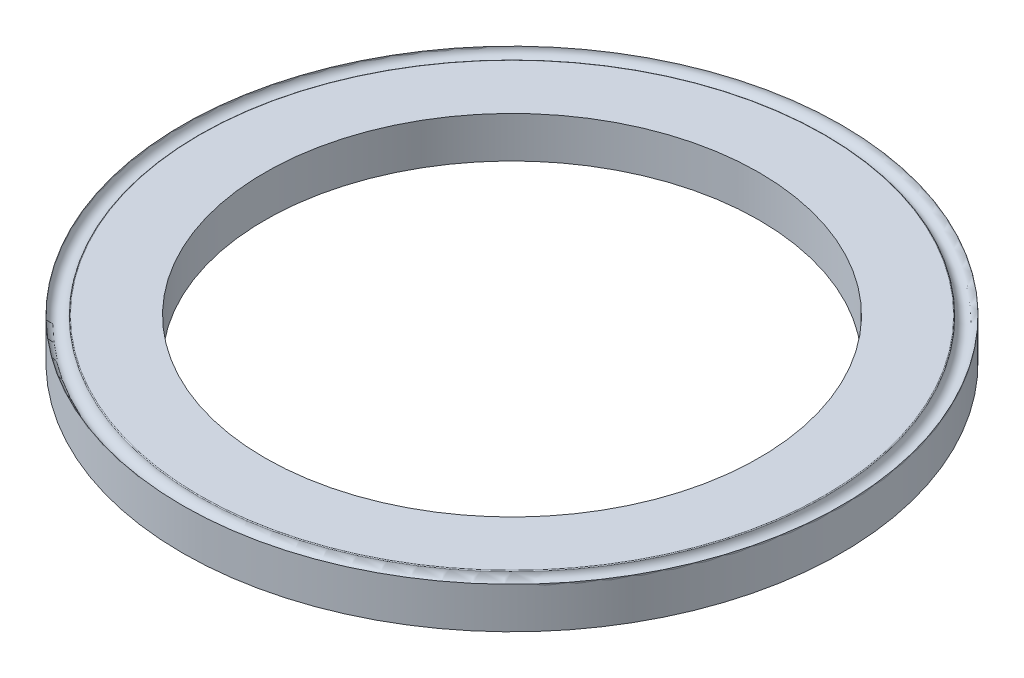
ISO-10303-21;
HEADER;
FILE_DESCRIPTION(('STEP AP214'),'2;1');
FILE_NAME('part.step','',(''),(''),'','','');
FILE_SCHEMA(('AUTOMOTIVE_DESIGN { 1 0 10303 214 1 1 1 1 }'));
ENDSEC;
DATA;
#1=APPLICATION_CONTEXT('core data for automotive mechanical design processes');
#2=APPLICATION_PROTOCOL_DEFINITION('international standard','automotive_design',2000,#1);
#3=PRODUCT_CONTEXT('',#1,'mechanical');
#4=PRODUCT('Part','Part','',(#3));
#5=PRODUCT_RELATED_PRODUCT_CATEGORY('part','',(#4));
#6=PRODUCT_DEFINITION_FORMATION('','',#4);
#7=PRODUCT_DEFINITION_CONTEXT('part definition',#1,'design');
#8=PRODUCT_DEFINITION('design','',#6,#7);
#9=PRODUCT_DEFINITION_SHAPE('','',#8);
#10=(LENGTH_UNIT() NAMED_UNIT(*) SI_UNIT(.MILLI.,.METRE.));
#11=(NAMED_UNIT(*) PLANE_ANGLE_UNIT() SI_UNIT($,.RADIAN.));
#12=(NAMED_UNIT(*) SI_UNIT($,.STERADIAN.) SOLID_ANGLE_UNIT());
#13=UNCERTAINTY_MEASURE_WITH_UNIT(LENGTH_MEASURE(1.E-05),#10,'distance_accuracy_value','');
#14=(GEOMETRIC_REPRESENTATION_CONTEXT(3) GLOBAL_UNCERTAINTY_ASSIGNED_CONTEXT((#13)) GLOBAL_UNIT_ASSIGNED_CONTEXT((#10,
#11,#12)) REPRESENTATION_CONTEXT('',''));
#15=CARTESIAN_POINT('',(0.,0.,0.));
#16=DIRECTION('',(0.,0.,1.));
#17=DIRECTION('',(1.,0.,0.));
#18=AXIS2_PLACEMENT_3D('',#15,#16,#17);
#19=CARTESIAN_POINT('',(0.,0.25,0.));
#20=DIRECTION('',(0.,1.,0.));
#21=DIRECTION('',(0.,0.,1.));
#22=AXIS2_PLACEMENT_3D('',#19,#20,#21);
#23=PLANE('',#22);
#24=CARTESIAN_POINT('',(0.,0.25,0.));
#25=DIRECTION('',(0.,1.,0.));
#26=DIRECTION('',(0.,0.,1.));
#27=AXIS2_PLACEMENT_3D('',#24,#25,#26);
#28=CIRCLE('',#27,3.79045548849897);
#29=CARTESIAN_POINT('',(0.,0.25,3.79045548849897));
#30=VERTEX_POINT('',#29);
#31=EDGE_CURVE('E60',#30,#30,#28,.T.);
#32=ORIENTED_EDGE('',*,*,#31,.T.);
#33=EDGE_LOOP('',(#32));
#34=FACE_BOUND('',#33,.T.);
#35=CARTESIAN_POINT('',(0.,0.25,0.));
#36=DIRECTION('',(0.,1.,0.));
#37=DIRECTION('',(0.,0.,1.));
#38=AXIS2_PLACEMENT_3D('',#35,#36,#37);
#39=CIRCLE('',#38,3.);
#40=CARTESIAN_POINT('',(0.,0.25,3.));
#41=VERTEX_POINT('',#40);
#42=EDGE_CURVE('E44',#41,#41,#39,.T.);
#43=ORIENTED_EDGE('',*,*,#42,.F.);
#44=EDGE_LOOP('',(#43));
#45=FACE_BOUND('',#44,.T.);
#46=ADVANCED_FACE('F37',(#34,#45),#23,.T.);
#47=CARTESIAN_POINT('',(0.,-0.25,0.));
#48=DIRECTION('',(0.,1.,0.));
#49=DIRECTION('',(0.,0.,1.));
#50=AXIS2_PLACEMENT_3D('',#47,#48,#49);
#51=PLANE('',#50);
#52=CARTESIAN_POINT('',(0.,-0.25,0.));
#53=DIRECTION('',(0.,1.,0.));
#54=DIRECTION('',(0.,0.,1.));
#55=AXIS2_PLACEMENT_3D('',#52,#53,#54);
#56=CIRCLE('',#55,4.);
#57=CARTESIAN_POINT('',(0.,-0.25,4.));
#58=VERTEX_POINT('',#57);
#59=EDGE_CURVE('E10',#58,#58,#56,.T.);
#60=ORIENTED_EDGE('',*,*,#59,.F.);
#61=EDGE_LOOP('',(#60));
#62=FACE_BOUND('',#61,.T.);
#63=CARTESIAN_POINT('',(0.,-0.25,0.));
#64=DIRECTION('',(0.,1.,0.));
#65=DIRECTION('',(0.,0.,1.));
#66=AXIS2_PLACEMENT_3D('',#63,#64,#65);
#67=CIRCLE('',#66,3.);
#68=CARTESIAN_POINT('',(0.,-0.25,3.));
#69=VERTEX_POINT('',#68);
#70=EDGE_CURVE('E48',#69,#69,#67,.T.);
#71=ORIENTED_EDGE('',*,*,#70,.T.);
#72=EDGE_LOOP('',(#71));
#73=FACE_BOUND('',#72,.T.);
#74=ADVANCED_FACE('F80',(#62,#73),#51,.F.);
#75=CARTESIAN_POINT('',(0.,0.25,0.));
#76=DIRECTION('',(0.,-1.,0.));
#77=DIRECTION('',(0.,0.,-1.));
#78=AXIS2_PLACEMENT_3D('',#75,#76,#77);
#79=CYLINDRICAL_SURFACE('',#78,4.);
#80=CARTESIAN_POINT('',(0.,0.25,0.));
#81=DIRECTION('',(0.,1.,0.));
#82=DIRECTION('',(0.,0.,1.));
#83=AXIS2_PLACEMENT_3D('',#80,#81,#82);
#84=CIRCLE('',#83,4.);
#85=CARTESIAN_POINT('',(0.,0.25,4.));
#86=VERTEX_POINT('',#85);
#87=EDGE_CURVE('E57',#86,#86,#84,.T.);
#88=ORIENTED_EDGE('',*,*,#87,.F.);
#89=EDGE_LOOP('',(#88));
#90=FACE_BOUND('',#89,.T.);
#91=ORIENTED_EDGE('',*,*,#59,.T.);
#92=EDGE_LOOP('',(#91));
#93=FACE_BOUND('',#92,.T.);
#94=ADVANCED_FACE('F39',(#90,#93),#79,.T.);
#95=CARTESIAN_POINT('',(0.,0.25,0.));
#96=DIRECTION('',(0.,-1.,0.));
#97=DIRECTION('',(0.,0.,-1.));
#98=AXIS2_PLACEMENT_3D('',#95,#96,#97);
#99=CYLINDRICAL_SURFACE('',#98,3.);
#100=ORIENTED_EDGE('',*,*,#42,.T.);
#101=EDGE_LOOP('',(#100));
#102=FACE_BOUND('',#101,.T.);
#103=ORIENTED_EDGE('',*,*,#70,.F.);
#104=EDGE_LOOP('',(#103));
#105=FACE_BOUND('',#104,.T.);
#106=ADVANCED_FACE('F70',(#102,#105),#99,.F.);
#107=CARTESIAN_POINT('',(0.,0.24,0.));
#108=DIRECTION('',(0.,1.,0.));
#109=DIRECTION('',(0.,0.,1.));
#110=AXIS2_PLACEMENT_3D('',#107,#108,#109);
#111=TOROIDAL_SURFACE('',#110,3.79045548849897,0.01);
#112=ORIENTED_EDGE('',*,*,#31,.F.);
#113=EDGE_LOOP('',(#112));
#114=FACE_BOUND('',#113,.T.);
#115=CARTESIAN_POINT('',(0.,0.240909090909091,0.));
#116=DIRECTION('',(0.,1.,0.));
#117=DIRECTION('',(0.,0.,1.));
#118=AXIS2_PLACEMENT_3D('',#115,#116,#117);
#119=CIRCLE('',#118,3.80041408045361);
#120=CARTESIAN_POINT('',(0.,0.240909090909091,3.80041408045361));
#121=VERTEX_POINT('',#120);
#122=EDGE_CURVE('E53',#121,#121,#119,.T.);
#123=ORIENTED_EDGE('',*,*,#122,.T.);
#124=EDGE_LOOP('',(#123));
#125=FACE_BOUND('',#124,.T.);
#126=ADVANCED_FACE('F66',(#114,#125),#111,.T.);
#127=CARTESIAN_POINT('',(0.,0.25,0.));
#128=DIRECTION('',(0.,1.,0.));
#129=DIRECTION('',(0.,0.,1.));
#130=AXIS2_PLACEMENT_3D('',#127,#128,#129);
#131=TOROIDAL_SURFACE('',#130,3.9,0.1);
#132=ORIENTED_EDGE('',*,*,#122,.F.);
#133=EDGE_LOOP('',(#132));
#134=FACE_BOUND('',#133,.T.);
#135=ORIENTED_EDGE('',*,*,#87,.T.);
#136=EDGE_LOOP('',(#135));
#137=FACE_BOUND('',#136,.T.);
#138=ADVANCED_FACE('F69',(#134,#137),#131,.F.);
#139=CLOSED_SHELL('',(#46,#74,#94,#106,#126,#138));
#140=MANIFOLD_SOLID_BREP('B2',#139);
#141=ADVANCED_BREP_SHAPE_REPRESENTATION('',(#18,#140),#14);
#142=SHAPE_DEFINITION_REPRESENTATION(#9,#141);
ENDSEC;
END-ISO-10303-21;
